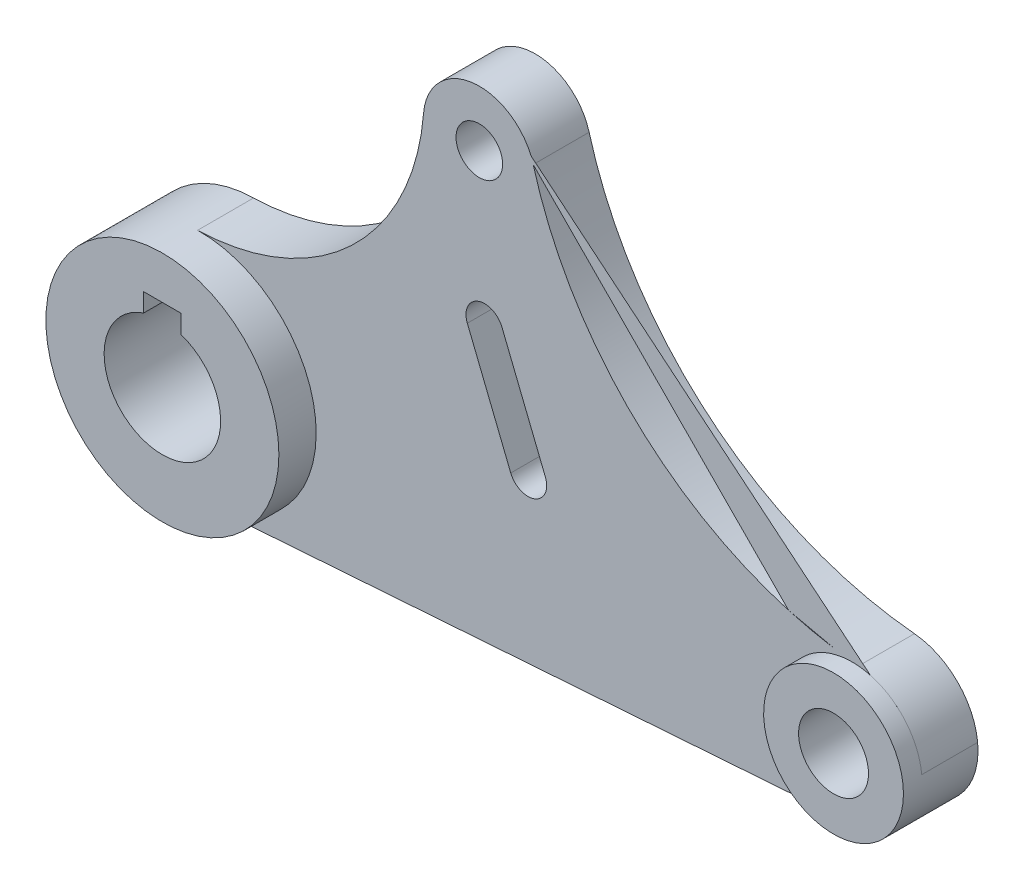
ISO-10303-21;
HEADER;
FILE_DESCRIPTION(('STEP AP214'),'2;1');
FILE_NAME('part.step','',(''),(''),'','','');
FILE_SCHEMA(('AUTOMOTIVE_DESIGN { 1 0 10303 214 1 1 1 1 }'));
ENDSEC;
DATA;
#1=APPLICATION_CONTEXT('core data for automotive mechanical design processes');
#2=APPLICATION_PROTOCOL_DEFINITION('international standard','automotive_design',2000,#1);
#3=PRODUCT_CONTEXT('',#1,'mechanical');
#4=PRODUCT('Part','Part','',(#3));
#5=PRODUCT_RELATED_PRODUCT_CATEGORY('part','',(#4));
#6=PRODUCT_DEFINITION_FORMATION('','',#4);
#7=PRODUCT_DEFINITION_CONTEXT('part definition',#1,'design');
#8=PRODUCT_DEFINITION('design','',#6,#7);
#9=PRODUCT_DEFINITION_SHAPE('','',#8);
#10=(LENGTH_UNIT() NAMED_UNIT(*) SI_UNIT(.MILLI.,.METRE.));
#11=(NAMED_UNIT(*) PLANE_ANGLE_UNIT() SI_UNIT($,.RADIAN.));
#12=(NAMED_UNIT(*) SI_UNIT($,.STERADIAN.) SOLID_ANGLE_UNIT());
#13=UNCERTAINTY_MEASURE_WITH_UNIT(LENGTH_MEASURE(1.E-05),#10,'distance_accuracy_value','');
#14=(GEOMETRIC_REPRESENTATION_CONTEXT(3) GLOBAL_UNCERTAINTY_ASSIGNED_CONTEXT((#13)) GLOBAL_UNIT_ASSIGNED_CONTEXT((#10,
#11,#12)) REPRESENTATION_CONTEXT('',''));
#15=CARTESIAN_POINT('',(0.,0.,0.));
#16=DIRECTION('',(0.,0.,1.));
#17=DIRECTION('',(1.,0.,0.));
#18=AXIS2_PLACEMENT_3D('',#15,#16,#17);
#19=CARTESIAN_POINT('',(0.000412175822356656,-0.000383614880965222,0.));
#20=DIRECTION('',(0.,0.,1.));
#21=DIRECTION('',(1.,0.,0.));
#22=AXIS2_PLACEMENT_3D('',#19,#20,#21);
#23=PLANE('',#22);
#24=DIRECTION('',(0.,-1.,0.));
#25=VECTOR('',#24,1.);
#26=CARTESIAN_POINT('',(-4.,15.8,0.));
#27=LINE('',#26,#25);
#28=CARTESIAN_POINT('',(-4.,15.8,0.));
#29=VERTEX_POINT('',#28);
#30=CARTESIAN_POINT('',(-4.,11.842719282327,0.));
#31=VERTEX_POINT('',#30);
#32=EDGE_CURVE('E171',#29,#31,#27,.T.);
#33=ORIENTED_EDGE('',*,*,#32,.T.);
#34=CARTESIAN_POINT('',(0.,0.,0.));
#35=DIRECTION('',(0.,0.,1.));
#36=DIRECTION('',(1.,0.,0.));
#37=AXIS2_PLACEMENT_3D('',#34,#35,#36);
#38=CIRCLE('',#37,12.5);
#39=CARTESIAN_POINT('',(4.,11.842719282327,0.));
#40=VERTEX_POINT('',#39);
#41=EDGE_CURVE('E245',#31,#40,#38,.T.);
#42=ORIENTED_EDGE('',*,*,#41,.T.);
#43=DIRECTION('',(0.,1.,0.));
#44=VECTOR('',#43,1.);
#45=CARTESIAN_POINT('',(4.,0.,0.));
#46=LINE('',#45,#44);
#47=CARTESIAN_POINT('',(4.,15.8,0.));
#48=VERTEX_POINT('',#47);
#49=EDGE_CURVE('E216',#40,#48,#46,.T.);
#50=ORIENTED_EDGE('',*,*,#49,.T.);
#51=DIRECTION('',(-1.,0.,0.));
#52=VECTOR('',#51,1.);
#53=CARTESIAN_POINT('',(4.,15.8,0.));
#54=LINE('',#53,#52);
#55=EDGE_CURVE('E206',#48,#29,#54,.T.);
#56=ORIENTED_EDGE('',*,*,#55,.T.);
#57=EDGE_LOOP('',(#33,#42,#50,#56));
#58=FACE_BOUND('',#57,.T.);
#59=CARTESIAN_POINT('',(60.,70.,0.));
#60=DIRECTION('',(0.,0.,1.));
#61=DIRECTION('',(1.,0.,0.));
#62=AXIS2_PLACEMENT_3D('',#59,#60,#61);
#63=CIRCLE('',#62,5.);
#64=CARTESIAN_POINT('',(65.,70.,0.));
#65=VERTEX_POINT('',#64);
#66=EDGE_CURVE('E227',#65,#65,#63,.T.);
#67=ORIENTED_EDGE('',*,*,#66,.T.);
#68=EDGE_LOOP('',(#67));
#69=FACE_BOUND('',#68,.T.);
#70=CARTESIAN_POINT('',(140.,0.,0.));
#71=DIRECTION('',(0.,0.,1.));
#72=DIRECTION('',(1.,0.,0.));
#73=AXIS2_PLACEMENT_3D('',#70,#71,#72);
#74=CIRCLE('',#73,7.50000000000001);
#75=CARTESIAN_POINT('',(147.5,0.,0.));
#76=VERTEX_POINT('',#75);
#77=EDGE_CURVE('E235',#76,#76,#74,.T.);
#78=ORIENTED_EDGE('',*,*,#77,.T.);
#79=EDGE_LOOP('',(#78));
#80=FACE_BOUND('',#79,.T.);
#81=CARTESIAN_POINT('',(139.999947806667,4.90708047234251E-05,0.));
#82=DIRECTION('',(0.,0.,1.));
#83=DIRECTION('',(1.,0.,0.));
#84=AXIS2_PLACEMENT_3D('',#81,#82,#83);
#85=CIRCLE('',#84,15.0000469577875);
#86=CARTESIAN_POINT('',(154.922943194199,1.51847503196316,0.));
#87=VERTEX_POINT('',#86);
#88=CARTESIAN_POINT('',(141.3656,14.9378,0.));
#89=VERTEX_POINT('',#88);
#90=EDGE_CURVE('E331',#87,#89,#85,.T.);
#91=ORIENTED_EDGE('',*,*,#90,.F.);
#92=CARTESIAN_POINT('',(140.,0.,0.));
#93=DIRECTION('',(0.,0.,-1.));
#94=DIRECTION('',(-1.,0.,0.));
#95=AXIS2_PLACEMENT_3D('',#92,#93,#94);
#96=CIRCLE('',#95,15.);
#97=CARTESIAN_POINT('',(141.07142945302,-14.9616828328037,0.));
#98=VERTEX_POINT('',#97);
#99=EDGE_CURVE('E303',#98,#87,#96,.F.);
#100=ORIENTED_EDGE('',*,*,#99,.F.);
#101=DIRECTION('',(0.997445711040491,0.0714286604027369,0.));
#102=VECTOR('',#101,1.);
#103=CARTESIAN_POINT('',(1.78571,-24.93615,0.));
#104=LINE('',#103,#102);
#105=CARTESIAN_POINT('',(1.78571,-24.93615,0.));
#106=VERTEX_POINT('',#105);
#107=EDGE_CURVE('E298',#106,#98,#104,.T.);
#108=ORIENTED_EDGE('',*,*,#107,.F.);
#109=CARTESIAN_POINT('',(0.000412175822356656,-0.000383614880965222,0.));
#110=DIRECTION('',(0.,0.,1.));
#111=DIRECTION('',(1.,0.,0.));
#112=AXIS2_PLACEMENT_3D('',#109,#110,#111);
#113=CIRCLE('',#112,24.999594667399);
#114=CARTESIAN_POINT('',(1.3514689833673,-24.963443904778,0.));
#115=VERTEX_POINT('',#114);
#116=EDGE_CURVE('E273',#115,#106,#113,.T.);
#117=ORIENTED_EDGE('',*,*,#116,.F.);
#118=CARTESIAN_POINT('',(0.,0.,0.));
#119=DIRECTION('',(0.,0.,1.));
#120=DIRECTION('',(1.,0.,0.));
#121=AXIS2_PLACEMENT_3D('',#118,#119,#120);
#122=CIRCLE('',#121,25.);
#123=CARTESIAN_POINT('',(-0.437439933241373,24.9961726331214,0.));
#124=VERTEX_POINT('',#123);
#125=EDGE_CURVE('E262',#124,#115,#122,.T.);
#126=ORIENTED_EDGE('',*,*,#125,.F.);
#127=CARTESIAN_POINT('',(-1.80176718211463,74.9798470910744,0.));
#128=DIRECTION('',(0.,0.,-1.));
#129=DIRECTION('',(-1.,0.,0.));
#130=AXIS2_PLACEMENT_3D('',#127,#128,#129);
#131=CIRCLE('',#130,50.0022909591215);
#132=CARTESIAN_POINT('',(48.039,70.964,0.));
#133=VERTEX_POINT('',#132);
#134=EDGE_CURVE('E278',#133,#124,#131,.T.);
#135=ORIENTED_EDGE('',*,*,#134,.F.);
#136=CARTESIAN_POINT('',(60.0001088726756,70.0001582980758,0.));
#137=DIRECTION('',(0.,0.,1.));
#138=DIRECTION('',(1.,0.,0.));
#139=AXIS2_PLACEMENT_3D('',#136,#137,#138);
#140=CIRCLE('',#139,11.9998798448304);
#141=CARTESIAN_POINT('',(71.563,73.209,0.));
#142=VERTEX_POINT('',#141);
#143=EDGE_CURVE('E302',#142,#133,#140,.T.);
#144=ORIENTED_EDGE('',*,*,#143,.F.);
#145=CARTESIAN_POINT('',(148.649917399147,94.6072104769718,0.));
#146=DIRECTION('',(0.,0.,-1.));
#147=DIRECTION('',(-1.,0.,0.));
#148=AXIS2_PLACEMENT_3D('',#145,#146,#147);
#149=CIRCLE('',#148,80.0017265171181);
#150=EDGE_CURVE('E299',#89,#142,#149,.T.);
#151=ORIENTED_EDGE('',*,*,#150,.F.);
#152=EDGE_LOOP('',(#91,#100,#108,#117,#126,#135,#144,#151));
#153=FACE_BOUND('',#152,.T.);
#154=CARTESIAN_POINT('',(70.4571,14.9771,0.));
#155=DIRECTION('',(0.,0.,1.));
#156=DIRECTION('',(1.,0.,0.));
#157=AXIS2_PLACEMENT_3D('',#154,#155,#156);
#158=CIRCLE('',#157,4.);
#159=CARTESIAN_POINT('',(66.7456490361782,13.4854124512331,0.));
#160=VERTEX_POINT('',#159);
#161=CARTESIAN_POINT('',(74.1685509638218,16.4687875487669,0.));
#162=VERTEX_POINT('',#161);
#163=EDGE_CURVE('E68',#160,#162,#158,.T.);
#164=ORIENTED_EDGE('',*,*,#163,.T.);
#165=DIRECTION('',(-0.372921887191715,0.927862740955455,0.));
#166=VECTOR('',#165,1.);
#167=CARTESIAN_POINT('',(74.1685509638218,16.4687875487669,0.));
#168=LINE('',#167,#166);
#169=CARTESIAN_POINT('',(64.8538509638218,39.6445875487669,0.));
#170=VERTEX_POINT('',#169);
#171=EDGE_CURVE('E175',#162,#170,#168,.T.);
#172=ORIENTED_EDGE('',*,*,#171,.T.);
#173=CARTESIAN_POINT('',(61.1424,38.1529,0.));
#174=DIRECTION('',(0.,0.,1.));
#175=DIRECTION('',(1.,0.,0.));
#176=AXIS2_PLACEMENT_3D('',#173,#174,#175);
#177=CIRCLE('',#176,4.);
#178=CARTESIAN_POINT('',(57.4309490361782,36.6612124512331,0.));
#179=VERTEX_POINT('',#178);
#180=EDGE_CURVE('E182',#170,#179,#177,.T.);
#181=ORIENTED_EDGE('',*,*,#180,.T.);
#182=DIRECTION('',(0.372921887191716,-0.927862740955455,0.));
#183=VECTOR('',#182,1.);
#184=CARTESIAN_POINT('',(57.4309490361782,36.6612124512331,0.));
#185=LINE('',#184,#183);
#186=EDGE_CURVE('E185',#179,#160,#185,.T.);
#187=ORIENTED_EDGE('',*,*,#186,.T.);
#188=EDGE_LOOP('',(#164,#172,#181,#187));
#189=FACE_BOUND('',#188,.T.);
#190=ADVANCED_FACE('F51',(#58,#69,#80,#153,#189),#23,.F.);
#191=CARTESIAN_POINT('',(0.000412175822356656,-0.000383614880965222,12.));
#192=DIRECTION('',(0.,0.,1.));
#193=DIRECTION('',(1.,0.,0.));
#194=AXIS2_PLACEMENT_3D('',#191,#192,#193);
#195=PLANE('',#194);
#196=CARTESIAN_POINT('',(60.,70.,12.));
#197=DIRECTION('',(0.,0.,1.));
#198=DIRECTION('',(1.,0.,0.));
#199=AXIS2_PLACEMENT_3D('',#196,#197,#198);
#200=CIRCLE('',#199,5.);
#201=CARTESIAN_POINT('',(65.,70.,12.));
#202=VERTEX_POINT('',#201);
#203=EDGE_CURVE('E231',#202,#202,#200,.F.);
#204=ORIENTED_EDGE('',*,*,#203,.T.);
#205=EDGE_LOOP('',(#204));
#206=FACE_BOUND('',#205,.T.);
#207=DIRECTION('',(0.997445711040491,0.0714286604027369,0.));
#208=VECTOR('',#207,1.);
#209=CARTESIAN_POINT('',(1.78571,-24.93615,12.));
#210=LINE('',#209,#208);
#211=CARTESIAN_POINT('',(1.78571,-24.93615,12.));
#212=VERTEX_POINT('',#211);
#213=CARTESIAN_POINT('',(141.071429497765,-14.9616799643542,12.));
#214=VERTEX_POINT('',#213);
#215=EDGE_CURVE('E277',#212,#214,#210,.T.);
#216=ORIENTED_EDGE('',*,*,#215,.T.);
#217=CARTESIAN_POINT('',(140.,0.,12.));
#218=DIRECTION('',(0.,0.,1.));
#219=DIRECTION('',(1.,0.,0.));
#220=AXIS2_PLACEMENT_3D('',#217,#218,#219);
#221=CIRCLE('',#220,15.);
#222=CARTESIAN_POINT('',(154.922943194199,1.51847503196316,12.));
#223=VERTEX_POINT('',#222);
#224=EDGE_CURVE('E252',#214,#223,#221,.F.);
#225=ORIENTED_EDGE('',*,*,#224,.T.);
#226=CARTESIAN_POINT('',(139.999947806667,4.90708047234251E-05,12.));
#227=DIRECTION('',(0.,0.,1.));
#228=DIRECTION('',(1.,0.,0.));
#229=AXIS2_PLACEMENT_3D('',#226,#227,#228);
#230=CIRCLE('',#229,15.0000469577875);
#231=CARTESIAN_POINT('',(141.3656,14.9378,12.));
#232=VERTEX_POINT('',#231);
#233=EDGE_CURVE('E282',#223,#232,#230,.T.);
#234=ORIENTED_EDGE('',*,*,#233,.T.);
#235=CARTESIAN_POINT('',(148.649917399147,94.6072104769718,12.));
#236=DIRECTION('',(0.,0.,-1.));
#237=DIRECTION('',(-1.,0.,0.));
#238=AXIS2_PLACEMENT_3D('',#235,#236,#237);
#239=CIRCLE('',#238,80.0017265171181);
#240=CARTESIAN_POINT('',(71.563,73.209,12.));
#241=VERTEX_POINT('',#240);
#242=EDGE_CURVE('E285',#232,#241,#239,.T.);
#243=ORIENTED_EDGE('',*,*,#242,.T.);
#244=CARTESIAN_POINT('',(60.0001088726756,70.0001582980758,12.));
#245=DIRECTION('',(0.,0.,1.));
#246=DIRECTION('',(1.,0.,0.));
#247=AXIS2_PLACEMENT_3D('',#244,#245,#246);
#248=CIRCLE('',#247,11.9998798448304);
#249=CARTESIAN_POINT('',(48.039,70.964,12.));
#250=VERTEX_POINT('',#249);
#251=EDGE_CURVE('E288',#241,#250,#248,.T.);
#252=ORIENTED_EDGE('',*,*,#251,.T.);
#253=CARTESIAN_POINT('',(-1.80176718211463,74.9798470910744,12.));
#254=DIRECTION('',(0.,0.,-1.));
#255=DIRECTION('',(-1.,0.,0.));
#256=AXIS2_PLACEMENT_3D('',#253,#254,#255);
#257=CIRCLE('',#256,50.0022909591215);
#258=CARTESIAN_POINT('',(-0.437439933241373,24.9961726331214,12.));
#259=VERTEX_POINT('',#258);
#260=EDGE_CURVE('E291',#250,#259,#257,.T.);
#261=ORIENTED_EDGE('',*,*,#260,.T.);
#262=CARTESIAN_POINT('',(0.,0.,12.));
#263=DIRECTION('',(0.,0.,1.));
#264=DIRECTION('',(1.,0.,0.));
#265=AXIS2_PLACEMENT_3D('',#262,#263,#264);
#266=CIRCLE('',#265,25.);
#267=EDGE_CURVE('E261',#259,#212,#266,.F.);
#268=ORIENTED_EDGE('',*,*,#267,.T.);
#269=EDGE_LOOP('',(#216,#225,#234,#243,#252,#261,#268));
#270=FACE_BOUND('',#269,.T.);
#271=DIRECTION('',(0.372921887191715,-0.927862740955455,0.));
#272=VECTOR('',#271,1.);
#273=CARTESIAN_POINT('',(69.5526014159611,27.953679550797,12.));
#274=LINE('',#273,#272);
#275=CARTESIAN_POINT('',(64.8538509638218,39.6445875487669,12.));
#276=VERTEX_POINT('',#275);
#277=CARTESIAN_POINT('',(74.1685509638218,16.4687875487669,12.));
#278=VERTEX_POINT('',#277);
#279=EDGE_CURVE('E61',#276,#278,#274,.T.);
#280=ORIENTED_EDGE('',*,*,#279,.T.);
#281=CARTESIAN_POINT('',(70.4571,14.9771,12.));
#282=DIRECTION('',(0.,0.,1.));
#283=DIRECTION('',(1.,0.,0.));
#284=AXIS2_PLACEMENT_3D('',#281,#282,#283);
#285=CIRCLE('',#284,4.);
#286=CARTESIAN_POINT('',(66.7456490361782,13.4854124512331,12.));
#287=VERTEX_POINT('',#286);
#288=EDGE_CURVE('E11',#278,#287,#285,.F.);
#289=ORIENTED_EDGE('',*,*,#288,.T.);
#290=DIRECTION('',(-0.372921887191716,0.927862740955455,0.));
#291=VECTOR('',#290,1.);
#292=CARTESIAN_POINT('',(62.1296994883175,24.9703044532633,12.));
#293=LINE('',#292,#291);
#294=CARTESIAN_POINT('',(57.4309490361782,36.6612124512331,12.));
#295=VERTEX_POINT('',#294);
#296=EDGE_CURVE('E348',#287,#295,#293,.T.);
#297=ORIENTED_EDGE('',*,*,#296,.T.);
#298=CARTESIAN_POINT('',(61.1424,38.1529,12.));
#299=DIRECTION('',(0.,0.,1.));
#300=DIRECTION('',(1.,0.,0.));
#301=AXIS2_PLACEMENT_3D('',#298,#299,#300);
#302=CIRCLE('',#301,4.);
#303=EDGE_CURVE('E352',#295,#276,#302,.F.);
#304=ORIENTED_EDGE('',*,*,#303,.T.);
#305=EDGE_LOOP('',(#280,#289,#297,#304));
#306=FACE_BOUND('',#305,.T.);
#307=ADVANCED_FACE('F357',(#206,#270,#306),#195,.T.);
#308=CARTESIAN_POINT('',(0.,0.,20.));
#309=DIRECTION('',(0.,0.,1.));
#310=DIRECTION('',(1.,0.,0.));
#311=AXIS2_PLACEMENT_3D('',#308,#309,#310);
#312=PLANE('',#311);
#313=CARTESIAN_POINT('',(0.,0.,20.));
#314=DIRECTION('',(0.,0.,1.));
#315=DIRECTION('',(1.,0.,0.));
#316=AXIS2_PLACEMENT_3D('',#313,#314,#315);
#317=CIRCLE('',#316,25.);
#318=CARTESIAN_POINT('',(25.,0.,20.));
#319=VERTEX_POINT('',#318);
#320=EDGE_CURVE('E257',#319,#319,#317,.T.);
#321=ORIENTED_EDGE('',*,*,#320,.T.);
#322=EDGE_LOOP('',(#321));
#323=FACE_BOUND('',#322,.T.);
#324=CARTESIAN_POINT('',(0.,0.,20.));
#325=DIRECTION('',(0.,0.,1.));
#326=DIRECTION('',(1.,0.,0.));
#327=AXIS2_PLACEMENT_3D('',#324,#325,#326);
#328=CIRCLE('',#327,12.5);
#329=CARTESIAN_POINT('',(-4.,11.842719282327,20.));
#330=VERTEX_POINT('',#329);
#331=CARTESIAN_POINT('',(4.,11.842719282327,20.));
#332=VERTEX_POINT('',#331);
#333=EDGE_CURVE('E240',#330,#332,#328,.T.);
#334=ORIENTED_EDGE('',*,*,#333,.F.);
#335=DIRECTION('',(0.,-1.,0.));
#336=VECTOR('',#335,1.);
#337=CARTESIAN_POINT('',(-4.,15.8,20.));
#338=LINE('',#337,#336);
#339=CARTESIAN_POINT('',(-4.,15.8,20.));
#340=VERTEX_POINT('',#339);
#341=EDGE_CURVE('E202',#340,#330,#338,.T.);
#342=ORIENTED_EDGE('',*,*,#341,.F.);
#343=DIRECTION('',(-1.,0.,0.));
#344=VECTOR('',#343,1.);
#345=CARTESIAN_POINT('',(4.,15.8,20.));
#346=LINE('',#345,#344);
#347=CARTESIAN_POINT('',(4.,15.8,20.));
#348=VERTEX_POINT('',#347);
#349=EDGE_CURVE('E209',#348,#340,#346,.T.);
#350=ORIENTED_EDGE('',*,*,#349,.F.);
#351=DIRECTION('',(0.,1.,0.));
#352=VECTOR('',#351,1.);
#353=CARTESIAN_POINT('',(4.,0.,20.));
#354=LINE('',#353,#352);
#355=EDGE_CURVE('E205',#332,#348,#354,.T.);
#356=ORIENTED_EDGE('',*,*,#355,.F.);
#357=EDGE_LOOP('',(#334,#342,#350,#356));
#358=FACE_BOUND('',#357,.T.);
#359=ADVANCED_FACE('F372',(#323,#358),#312,.T.);
#360=CARTESIAN_POINT('',(0.,0.,20.));
#361=DIRECTION('',(0.,0.,-1.));
#362=DIRECTION('',(-1.,0.,0.));
#363=AXIS2_PLACEMENT_3D('',#360,#361,#362);
#364=CYLINDRICAL_SURFACE('',#363,12.5);
#365=ORIENTED_EDGE('',*,*,#41,.F.);
#366=DIRECTION('',(0.,0.,-1.));
#367=VECTOR('',#366,1.);
#368=CARTESIAN_POINT('',(-4.,11.842719282327,20.));
#369=LINE('',#368,#367);
#370=EDGE_CURVE('E344',#31,#330,#369,.F.);
#371=ORIENTED_EDGE('',*,*,#370,.T.);
#372=ORIENTED_EDGE('',*,*,#333,.T.);
#373=DIRECTION('',(0.,0.,-1.));
#374=VECTOR('',#373,1.);
#375=CARTESIAN_POINT('',(4.,11.842719282327,20.));
#376=LINE('',#375,#374);
#377=EDGE_CURVE('E325',#332,#40,#376,.T.);
#378=ORIENTED_EDGE('',*,*,#377,.T.);
#379=EDGE_LOOP('',(#365,#371,#372,#378));
#380=FACE_BOUND('',#379,.T.);
#381=ADVANCED_FACE('F403',(#380),#364,.F.);
#382=CARTESIAN_POINT('',(139.999947806667,4.90708047234251E-05,12.));
#383=DIRECTION('',(0.,0.,-1.));
#384=DIRECTION('',(-1.,0.,0.));
#385=AXIS2_PLACEMENT_3D('',#382,#383,#384);
#386=CYLINDRICAL_SURFACE('',#385,15.0000469577875);
#387=DIRECTION('',(0.,0.,-1.));
#388=VECTOR('',#387,1.);
#389=CARTESIAN_POINT('',(154.922943194199,1.51847503196316,8.));
#390=LINE('',#389,#388);
#391=EDGE_CURVE('E256',#87,#223,#390,.F.);
#392=ORIENTED_EDGE('',*,*,#391,.F.);
#393=ORIENTED_EDGE('',*,*,#90,.T.);
#394=DIRECTION('',(0.,0.,-1.));
#395=VECTOR('',#394,1.);
#396=CARTESIAN_POINT('',(141.3656,14.9378,12.));
#397=LINE('',#396,#395);
#398=EDGE_CURVE('E316',#232,#89,#397,.T.);
#399=ORIENTED_EDGE('',*,*,#398,.F.);
#400=ORIENTED_EDGE('',*,*,#233,.F.);
#401=EDGE_LOOP('',(#392,#393,#399,#400));
#402=FACE_BOUND('',#401,.T.);
#403=ADVANCED_FACE('F400',(#402),#386,.T.);
#404=CARTESIAN_POINT('',(0.000412175822356656,-0.000383614880965222,12.));
#405=DIRECTION('',(0.,0.,-1.));
#406=DIRECTION('',(-1.,0.,0.));
#407=AXIS2_PLACEMENT_3D('',#404,#405,#406);
#408=CYLINDRICAL_SURFACE('',#407,24.999594667399);
#409=DIRECTION('',(0.,0.,-1.));
#410=VECTOR('',#409,1.);
#411=CARTESIAN_POINT('',(1.3514689833673,-24.963443904778,10.));
#412=LINE('',#411,#410);
#413=CARTESIAN_POINT('',(1.35146898336729,-24.963443904778,12.));
#414=VERTEX_POINT('',#413);
#415=EDGE_CURVE('E270',#115,#414,#412,.F.);
#416=ORIENTED_EDGE('',*,*,#415,.F.);
#417=ORIENTED_EDGE('',*,*,#116,.T.);
#418=DIRECTION('',(0.,0.,-1.));
#419=VECTOR('',#418,1.);
#420=CARTESIAN_POINT('',(1.78571,-24.93615,12.));
#421=LINE('',#420,#419);
#422=EDGE_CURVE('E321',#212,#106,#421,.T.);
#423=ORIENTED_EDGE('',*,*,#422,.F.);
#424=CARTESIAN_POINT('',(0.000412175822356656,-0.000383614880965222,12.));
#425=DIRECTION('',(0.,0.,1.));
#426=DIRECTION('',(1.,0.,0.));
#427=AXIS2_PLACEMENT_3D('',#424,#425,#426);
#428=CIRCLE('',#427,24.999594667399);
#429=EDGE_CURVE('E274',#414,#212,#428,.T.);
#430=ORIENTED_EDGE('',*,*,#429,.F.);
#431=EDGE_LOOP('',(#416,#417,#423,#430));
#432=FACE_BOUND('',#431,.T.);
#433=ADVANCED_FACE('F54',(#432),#408,.T.);
#434=CARTESIAN_POINT('',(-1.80176718211463,74.9798470910744,12.));
#435=DIRECTION('',(0.,0.,-1.));
#436=DIRECTION('',(-1.,0.,0.));
#437=AXIS2_PLACEMENT_3D('',#434,#435,#436);
#438=CYLINDRICAL_SURFACE('',#437,50.0022909591215);
#439=DIRECTION('',(0.,0.,-1.));
#440=VECTOR('',#439,1.);
#441=CARTESIAN_POINT('',(-0.437439933241373,24.9961726331214,10.));
#442=LINE('',#441,#440);
#443=EDGE_CURVE('E267',#259,#124,#442,.T.);
#444=ORIENTED_EDGE('',*,*,#443,.F.);
#445=ORIENTED_EDGE('',*,*,#260,.F.);
#446=DIRECTION('',(0.,0.,-1.));
#447=VECTOR('',#446,1.);
#448=CARTESIAN_POINT('',(48.039,70.964,12.));
#449=LINE('',#448,#447);
#450=EDGE_CURVE('E295',#250,#133,#449,.T.);
#451=ORIENTED_EDGE('',*,*,#450,.T.);
#452=ORIENTED_EDGE('',*,*,#134,.T.);
#453=EDGE_LOOP('',(#444,#445,#451,#452));
#454=FACE_BOUND('',#453,.T.);
#455=ADVANCED_FACE('F381',(#454),#438,.F.);
#456=CARTESIAN_POINT('',(1.78571,-24.93615,12.));
#457=DIRECTION('',(-0.0714286604027369,0.997445711040491,0.));
#458=DIRECTION('',(-0.997445711040491,-0.0714286604027369,0.));
#459=AXIS2_PLACEMENT_3D('',#456,#457,#458);
#460=PLANE('',#459);
#461=ORIENTED_EDGE('',*,*,#107,.T.);
#462=DIRECTION('',(0.,0.,-1.));
#463=VECTOR('',#462,1.);
#464=CARTESIAN_POINT('',(141.071429,-14.96168,12.));
#465=LINE('',#464,#463);
#466=EDGE_CURVE('E320',#214,#98,#465,.T.);
#467=ORIENTED_EDGE('',*,*,#466,.F.);
#468=ORIENTED_EDGE('',*,*,#215,.F.);
#469=ORIENTED_EDGE('',*,*,#422,.T.);
#470=EDGE_LOOP('',(#461,#467,#468,#469));
#471=FACE_BOUND('',#470,.T.);
#472=ADVANCED_FACE('F385',(#471),#460,.F.);
#473=CARTESIAN_POINT('',(148.649917399147,94.6072104769718,12.));
#474=DIRECTION('',(0.,0.,-1.));
#475=DIRECTION('',(-1.,0.,0.));
#476=AXIS2_PLACEMENT_3D('',#473,#474,#475);
#477=CYLINDRICAL_SURFACE('',#476,80.0017265171181);
#478=ORIENTED_EDGE('',*,*,#150,.T.);
#479=DIRECTION('',(0.,0.,-1.));
#480=VECTOR('',#479,1.);
#481=CARTESIAN_POINT('',(71.563,73.209,12.));
#482=LINE('',#481,#480);
#483=EDGE_CURVE('E312',#241,#142,#482,.T.);
#484=ORIENTED_EDGE('',*,*,#483,.F.);
#485=ORIENTED_EDGE('',*,*,#242,.F.);
#486=ORIENTED_EDGE('',*,*,#398,.T.);
#487=EDGE_LOOP('',(#478,#484,#485,#486));
#488=FACE_BOUND('',#487,.T.);
#489=ADVANCED_FACE('F394',(#488),#477,.F.);
#490=CARTESIAN_POINT('',(60.0001088726756,70.0001582980758,12.));
#491=DIRECTION('',(0.,0.,-1.));
#492=DIRECTION('',(-1.,0.,0.));
#493=AXIS2_PLACEMENT_3D('',#490,#491,#492);
#494=CYLINDRICAL_SURFACE('',#493,11.9998798448304);
#495=ORIENTED_EDGE('',*,*,#143,.T.);
#496=ORIENTED_EDGE('',*,*,#450,.F.);
#497=ORIENTED_EDGE('',*,*,#251,.F.);
#498=ORIENTED_EDGE('',*,*,#483,.T.);
#499=EDGE_LOOP('',(#495,#496,#497,#498));
#500=FACE_BOUND('',#499,.T.);
#501=ADVANCED_FACE('F388',(#500),#494,.T.);
#502=CARTESIAN_POINT('',(0.,0.,20.));
#503=DIRECTION('',(0.,0.,-1.));
#504=DIRECTION('',(-1.,0.,0.));
#505=AXIS2_PLACEMENT_3D('',#502,#503,#504);
#506=CYLINDRICAL_SURFACE('',#505,25.);
#507=ORIENTED_EDGE('',*,*,#320,.F.);
#508=EDGE_LOOP('',(#507));
#509=FACE_BOUND('',#508,.T.);
#510=ORIENTED_EDGE('',*,*,#415,.T.);
#511=ORIENTED_EDGE('',*,*,#429,.T.);
#512=ORIENTED_EDGE('',*,*,#267,.F.);
#513=ORIENTED_EDGE('',*,*,#443,.T.);
#514=ORIENTED_EDGE('',*,*,#125,.T.);
#515=EDGE_LOOP('',(#510,#511,#512,#513,#514));
#516=FACE_BOUND('',#515,.T.);
#517=ADVANCED_FACE('F393',(#509,#516),#506,.T.);
#518=CARTESIAN_POINT('',(140.,0.,16.));
#519=DIRECTION('',(0.,0.,-1.));
#520=DIRECTION('',(-1.,0.,0.));
#521=AXIS2_PLACEMENT_3D('',#518,#519,#520);
#522=CYLINDRICAL_SURFACE('',#521,15.);
#523=ORIENTED_EDGE('',*,*,#466,.T.);
#524=ORIENTED_EDGE('',*,*,#99,.T.);
#525=ORIENTED_EDGE('',*,*,#391,.T.);
#526=ORIENTED_EDGE('',*,*,#224,.F.);
#527=EDGE_LOOP('',(#523,#524,#525,#526));
#528=FACE_BOUND('',#527,.T.);
#529=CARTESIAN_POINT('',(140.,0.,16.));
#530=DIRECTION('',(0.,0.,1.));
#531=DIRECTION('',(1.,0.,0.));
#532=AXIS2_PLACEMENT_3D('',#529,#530,#531);
#533=CIRCLE('',#532,15.);
#534=CARTESIAN_POINT('',(155.,0.,16.));
#535=VERTEX_POINT('',#534);
#536=EDGE_CURVE('E244',#535,#535,#533,.T.);
#537=ORIENTED_EDGE('',*,*,#536,.F.);
#538=EDGE_LOOP('',(#537));
#539=FACE_BOUND('',#538,.T.);
#540=ADVANCED_FACE('F419',(#528,#539),#522,.T.);
#541=CARTESIAN_POINT('',(140.,0.,16.));
#542=DIRECTION('',(0.,0.,1.));
#543=DIRECTION('',(1.,0.,0.));
#544=AXIS2_PLACEMENT_3D('',#541,#542,#543);
#545=PLANE('',#544);
#546=CARTESIAN_POINT('',(140.,0.,16.));
#547=DIRECTION('',(0.,0.,1.));
#548=DIRECTION('',(1.,0.,0.));
#549=AXIS2_PLACEMENT_3D('',#546,#547,#548);
#550=CIRCLE('',#549,7.50000000000001);
#551=CARTESIAN_POINT('',(147.5,0.,16.));
#552=VERTEX_POINT('',#551);
#553=EDGE_CURVE('E239',#552,#552,#550,.F.);
#554=ORIENTED_EDGE('',*,*,#553,.T.);
#555=EDGE_LOOP('',(#554));
#556=FACE_BOUND('',#555,.T.);
#557=ORIENTED_EDGE('',*,*,#536,.T.);
#558=EDGE_LOOP('',(#557));
#559=FACE_BOUND('',#558,.T.);
#560=ADVANCED_FACE('F441',(#556,#559),#545,.T.);
#561=CARTESIAN_POINT('',(140.,0.,20.));
#562=DIRECTION('',(0.,0.,-1.));
#563=DIRECTION('',(-1.,0.,0.));
#564=AXIS2_PLACEMENT_3D('',#561,#562,#563);
#565=CYLINDRICAL_SURFACE('',#564,7.50000000000001);
#566=ORIENTED_EDGE('',*,*,#553,.F.);
#567=EDGE_LOOP('',(#566));
#568=FACE_BOUND('',#567,.T.);
#569=ORIENTED_EDGE('',*,*,#77,.F.);
#570=EDGE_LOOP('',(#569));
#571=FACE_BOUND('',#570,.T.);
#572=ADVANCED_FACE('F454',(#568,#571),#565,.F.);
#573=CARTESIAN_POINT('',(60.,70.,20.));
#574=DIRECTION('',(0.,0.,-1.));
#575=DIRECTION('',(-1.,0.,0.));
#576=AXIS2_PLACEMENT_3D('',#573,#574,#575);
#577=CYLINDRICAL_SURFACE('',#576,5.);
#578=ORIENTED_EDGE('',*,*,#203,.F.);
#579=EDGE_LOOP('',(#578));
#580=FACE_BOUND('',#579,.T.);
#581=ORIENTED_EDGE('',*,*,#66,.F.);
#582=EDGE_LOOP('',(#581));
#583=FACE_BOUND('',#582,.T.);
#584=ADVANCED_FACE('F462',(#580,#583),#577,.F.);
#585=CARTESIAN_POINT('',(-4.,15.8,20.));
#586=DIRECTION('',(1.,0.,0.));
#587=DIRECTION('',(0.,0.,-1.));
#588=AXIS2_PLACEMENT_3D('',#585,#586,#587);
#589=PLANE('',#588);
#590=ORIENTED_EDGE('',*,*,#32,.F.);
#591=DIRECTION('',(0.,0.,-1.));
#592=VECTOR('',#591,1.);
#593=CARTESIAN_POINT('',(-4.,15.8,20.));
#594=LINE('',#593,#592);
#595=EDGE_CURVE('E212',#340,#29,#594,.T.);
#596=ORIENTED_EDGE('',*,*,#595,.F.);
#597=ORIENTED_EDGE('',*,*,#341,.T.);
#598=ORIENTED_EDGE('',*,*,#370,.F.);
#599=EDGE_LOOP('',(#590,#596,#597,#598));
#600=FACE_BOUND('',#599,.T.);
#601=ADVANCED_FACE('F467',(#600),#589,.T.);
#602=CARTESIAN_POINT('',(4.,0.,20.));
#603=DIRECTION('',(-1.,0.,0.));
#604=DIRECTION('',(0.,0.,1.));
#605=AXIS2_PLACEMENT_3D('',#602,#603,#604);
#606=PLANE('',#605);
#607=ORIENTED_EDGE('',*,*,#355,.T.);
#608=DIRECTION('',(0.,0.,-1.));
#609=VECTOR('',#608,1.);
#610=CARTESIAN_POINT('',(4.,15.8,20.));
#611=LINE('',#610,#609);
#612=EDGE_CURVE('E225',#348,#48,#611,.T.);
#613=ORIENTED_EDGE('',*,*,#612,.T.);
#614=ORIENTED_EDGE('',*,*,#49,.F.);
#615=ORIENTED_EDGE('',*,*,#377,.F.);
#616=EDGE_LOOP('',(#607,#613,#614,#615));
#617=FACE_BOUND('',#616,.T.);
#618=ADVANCED_FACE('F472',(#617),#606,.T.);
#619=CARTESIAN_POINT('',(4.,15.8,20.));
#620=DIRECTION('',(0.,-1.,0.));
#621=DIRECTION('',(0.,0.,-1.));
#622=AXIS2_PLACEMENT_3D('',#619,#620,#621);
#623=PLANE('',#622);
#624=ORIENTED_EDGE('',*,*,#55,.F.);
#625=ORIENTED_EDGE('',*,*,#612,.F.);
#626=ORIENTED_EDGE('',*,*,#349,.T.);
#627=ORIENTED_EDGE('',*,*,#595,.T.);
#628=EDGE_LOOP('',(#624,#625,#626,#627));
#629=FACE_BOUND('',#628,.T.);
#630=ADVANCED_FACE('F477',(#629),#623,.T.);
#631=CARTESIAN_POINT('',(70.4571,14.9771,20.));
#632=DIRECTION('',(0.,0.,-1.));
#633=DIRECTION('',(-1.,0.,0.));
#634=AXIS2_PLACEMENT_3D('',#631,#632,#633);
#635=CYLINDRICAL_SURFACE('',#634,4.);
#636=DIRECTION('',(0.,0.,-1.));
#637=VECTOR('',#636,1.);
#638=CARTESIAN_POINT('',(74.1685509638218,16.4687875487669,20.));
#639=LINE('',#638,#637);
#640=EDGE_CURVE('E165',#278,#162,#639,.T.);
#641=ORIENTED_EDGE('',*,*,#640,.T.);
#642=ORIENTED_EDGE('',*,*,#163,.F.);
#643=DIRECTION('',(0.,0.,-1.));
#644=VECTOR('',#643,1.);
#645=CARTESIAN_POINT('',(66.7456490361782,13.4854124512331,20.));
#646=LINE('',#645,#644);
#647=EDGE_CURVE('E195',#287,#160,#646,.T.);
#648=ORIENTED_EDGE('',*,*,#647,.F.);
#649=ORIENTED_EDGE('',*,*,#288,.F.);
#650=EDGE_LOOP('',(#641,#642,#648,#649));
#651=FACE_BOUND('',#650,.T.);
#652=ADVANCED_FACE('F167',(#651),#635,.F.);
#653=CARTESIAN_POINT('',(74.1685509638218,16.4687875487669,20.));
#654=DIRECTION('',(-0.927862740955455,-0.372921887191715,0.));
#655=DIRECTION('',(0.372921887191715,-0.927862740955455,0.));
#656=AXIS2_PLACEMENT_3D('',#653,#654,#655);
#657=PLANE('',#656);
#658=DIRECTION('',(0.,0.,-1.));
#659=VECTOR('',#658,1.);
#660=CARTESIAN_POINT('',(64.8538509638218,39.6445875487669,20.));
#661=LINE('',#660,#659);
#662=EDGE_CURVE('E172',#276,#170,#661,.T.);
#663=ORIENTED_EDGE('',*,*,#662,.T.);
#664=ORIENTED_EDGE('',*,*,#171,.F.);
#665=ORIENTED_EDGE('',*,*,#640,.F.);
#666=ORIENTED_EDGE('',*,*,#279,.F.);
#667=EDGE_LOOP('',(#663,#664,#665,#666));
#668=FACE_BOUND('',#667,.T.);
#669=ADVANCED_FACE('F176',(#668),#657,.T.);
#670=CARTESIAN_POINT('',(61.1424,38.1529,20.));
#671=DIRECTION('',(0.,0.,-1.));
#672=DIRECTION('',(-1.,0.,0.));
#673=AXIS2_PLACEMENT_3D('',#670,#671,#672);
#674=CYLINDRICAL_SURFACE('',#673,4.);
#675=DIRECTION('',(0.,0.,-1.));
#676=VECTOR('',#675,1.);
#677=CARTESIAN_POINT('',(57.4309490361782,36.6612124512331,20.));
#678=LINE('',#677,#676);
#679=EDGE_CURVE('E76',#295,#179,#678,.T.);
#680=ORIENTED_EDGE('',*,*,#679,.T.);
#681=ORIENTED_EDGE('',*,*,#180,.F.);
#682=ORIENTED_EDGE('',*,*,#662,.F.);
#683=ORIENTED_EDGE('',*,*,#303,.F.);
#684=EDGE_LOOP('',(#680,#681,#682,#683));
#685=FACE_BOUND('',#684,.T.);
#686=ADVANCED_FACE('F359',(#685),#674,.F.);
#687=CARTESIAN_POINT('',(57.4309490361782,36.6612124512331,20.));
#688=DIRECTION('',(0.927862740955455,0.372921887191716,0.));
#689=DIRECTION('',(-0.372921887191716,0.927862740955455,0.));
#690=AXIS2_PLACEMENT_3D('',#687,#688,#689);
#691=PLANE('',#690);
#692=ORIENTED_EDGE('',*,*,#647,.T.);
#693=ORIENTED_EDGE('',*,*,#186,.F.);
#694=ORIENTED_EDGE('',*,*,#679,.F.);
#695=ORIENTED_EDGE('',*,*,#296,.F.);
#696=EDGE_LOOP('',(#692,#693,#694,#695));
#697=FACE_BOUND('',#696,.T.);
#698=ADVANCED_FACE('F360',(#697),#691,.T.);
#699=CLOSED_SHELL('',(#190,#307,#359,#381,#403,#433,#455,#472,#489,#501,#517,#540,#560,#572,
#584,#601,#618,#630,#652,#669,#686,#698));
#700=MANIFOLD_SOLID_BREP('B2',#699);
#701=ADVANCED_BREP_SHAPE_REPRESENTATION('',(#18,#700),#14);
#702=SHAPE_DEFINITION_REPRESENTATION(#9,#701);
ENDSEC;
END-ISO-10303-21;
